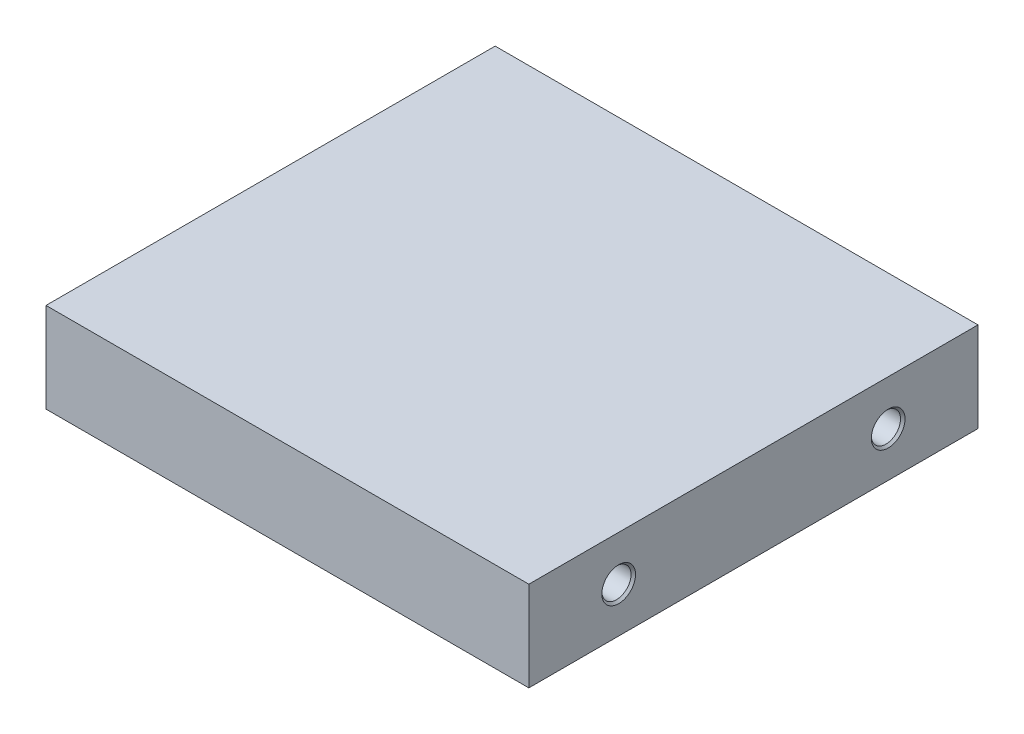
ISO-10303-21;
HEADER;
FILE_DESCRIPTION(('STEP AP214'),'2;1');
FILE_NAME('part.step','',(''),(''),'','','');
FILE_SCHEMA(('AUTOMOTIVE_DESIGN { 1 0 10303 214 1 1 1 1 }'));
ENDSEC;
DATA;
#1=APPLICATION_CONTEXT('core data for automotive mechanical design processes');
#2=APPLICATION_PROTOCOL_DEFINITION('international standard','automotive_design',2000,#1);
#3=PRODUCT_CONTEXT('',#1,'mechanical');
#4=PRODUCT('Part','Part','',(#3));
#5=PRODUCT_RELATED_PRODUCT_CATEGORY('part','',(#4));
#6=PRODUCT_DEFINITION_FORMATION('','',#4);
#7=PRODUCT_DEFINITION_CONTEXT('part definition',#1,'design');
#8=PRODUCT_DEFINITION('design','',#6,#7);
#9=PRODUCT_DEFINITION_SHAPE('','',#8);
#10=(LENGTH_UNIT() NAMED_UNIT(*) SI_UNIT(.MILLI.,.METRE.));
#11=(NAMED_UNIT(*) PLANE_ANGLE_UNIT() SI_UNIT($,.RADIAN.));
#12=(NAMED_UNIT(*) SI_UNIT($,.STERADIAN.) SOLID_ANGLE_UNIT());
#13=UNCERTAINTY_MEASURE_WITH_UNIT(LENGTH_MEASURE(1.E-05),#10,'distance_accuracy_value','');
#14=(GEOMETRIC_REPRESENTATION_CONTEXT(3) GLOBAL_UNCERTAINTY_ASSIGNED_CONTEXT((#13)) GLOBAL_UNIT_ASSIGNED_CONTEXT((#10,
#11,#12)) REPRESENTATION_CONTEXT('',''));
#15=CARTESIAN_POINT('',(0.,0.,0.));
#16=DIRECTION('',(0.,0.,1.));
#17=DIRECTION('',(1.,0.,0.));
#18=AXIS2_PLACEMENT_3D('',#15,#16,#17);
#19=CARTESIAN_POINT('',(21.5,8.,-20.));
#20=DIRECTION('',(-1.,0.,0.));
#21=DIRECTION('',(0.,0.,1.));
#22=AXIS2_PLACEMENT_3D('',#19,#20,#21);
#23=PLANE('',#22);
#24=CARTESIAN_POINT('',(21.5,4.,12.));
#25=DIRECTION('',(-1.,0.,0.));
#26=DIRECTION('',(0.,0.,1.));
#27=AXIS2_PLACEMENT_3D('',#24,#25,#26);
#28=CIRCLE('',#27,1.49999999999999);
#29=CARTESIAN_POINT('',(21.5,4.,13.5));
#30=VERTEX_POINT('',#29);
#31=EDGE_CURVE('E120',#30,#30,#28,.T.);
#32=ORIENTED_EDGE('',*,*,#31,.T.);
#33=EDGE_LOOP('',(#32));
#34=FACE_BOUND('',#33,.T.);
#35=CARTESIAN_POINT('',(21.5,4.,-12.));
#36=DIRECTION('',(-1.,0.,0.));
#37=DIRECTION('',(0.,0.,1.));
#38=AXIS2_PLACEMENT_3D('',#35,#36,#37);
#39=CIRCLE('',#38,1.49999999999999);
#40=CARTESIAN_POINT('',(21.5,4.,-10.5));
#41=VERTEX_POINT('',#40);
#42=EDGE_CURVE('E117',#41,#41,#39,.T.);
#43=ORIENTED_EDGE('',*,*,#42,.T.);
#44=EDGE_LOOP('',(#43));
#45=FACE_BOUND('',#44,.T.);
#46=DIRECTION('',(0.,0.,-1.));
#47=VECTOR('',#46,1.);
#48=CARTESIAN_POINT('',(21.5,0.,-20.));
#49=LINE('',#48,#47);
#50=CARTESIAN_POINT('',(21.5,0.,20.));
#51=VERTEX_POINT('',#50);
#52=CARTESIAN_POINT('',(21.5,0.,-20.));
#53=VERTEX_POINT('',#52);
#54=EDGE_CURVE('E107',#51,#53,#49,.T.);
#55=ORIENTED_EDGE('',*,*,#54,.T.);
#56=DIRECTION('',(0.,-1.,0.));
#57=VECTOR('',#56,1.);
#58=CARTESIAN_POINT('',(21.5,8.,-20.));
#59=LINE('',#58,#57);
#60=CARTESIAN_POINT('',(21.5,8.,-20.));
#61=VERTEX_POINT('',#60);
#62=EDGE_CURVE('E98',#61,#53,#59,.T.);
#63=ORIENTED_EDGE('',*,*,#62,.F.);
#64=DIRECTION('',(0.,0.,-1.));
#65=VECTOR('',#64,1.);
#66=CARTESIAN_POINT('',(21.5,8.,-20.));
#67=LINE('',#66,#65);
#68=CARTESIAN_POINT('',(21.5,8.,20.));
#69=VERTEX_POINT('',#68);
#70=EDGE_CURVE('E92',#69,#61,#67,.T.);
#71=ORIENTED_EDGE('',*,*,#70,.F.);
#72=DIRECTION('',(0.,-1.,0.));
#73=VECTOR('',#72,1.);
#74=CARTESIAN_POINT('',(21.5,8.,20.));
#75=LINE('',#74,#73);
#76=EDGE_CURVE('E103',#69,#51,#75,.T.);
#77=ORIENTED_EDGE('',*,*,#76,.T.);
#78=EDGE_LOOP('',(#55,#63,#71,#77));
#79=FACE_BOUND('',#78,.T.);
#80=ADVANCED_FACE('F38',(#34,#45,#79),#23,.F.);
#81=CARTESIAN_POINT('',(-21.5,8.,-20.));
#82=DIRECTION('',(0.,0.,1.));
#83=DIRECTION('',(1.,0.,0.));
#84=AXIS2_PLACEMENT_3D('',#81,#82,#83);
#85=PLANE('',#84);
#86=DIRECTION('',(-1.,0.,0.));
#87=VECTOR('',#86,1.);
#88=CARTESIAN_POINT('',(-21.5,0.,-20.));
#89=LINE('',#88,#87);
#90=CARTESIAN_POINT('',(-21.5,0.,-20.));
#91=VERTEX_POINT('',#90);
#92=EDGE_CURVE('E97',#53,#91,#89,.T.);
#93=ORIENTED_EDGE('',*,*,#92,.T.);
#94=DIRECTION('',(0.,-1.,0.));
#95=VECTOR('',#94,1.);
#96=CARTESIAN_POINT('',(-21.5,8.,-20.));
#97=LINE('',#96,#95);
#98=CARTESIAN_POINT('',(-21.5,8.,-20.));
#99=VERTEX_POINT('',#98);
#100=EDGE_CURVE('E95',#99,#91,#97,.T.);
#101=ORIENTED_EDGE('',*,*,#100,.F.);
#102=DIRECTION('',(-1.,0.,0.));
#103=VECTOR('',#102,1.);
#104=CARTESIAN_POINT('',(-21.5,8.,-20.));
#105=LINE('',#104,#103);
#106=EDGE_CURVE('E87',#61,#99,#105,.T.);
#107=ORIENTED_EDGE('',*,*,#106,.F.);
#108=ORIENTED_EDGE('',*,*,#62,.T.);
#109=EDGE_LOOP('',(#93,#101,#107,#108));
#110=FACE_BOUND('',#109,.T.);
#111=ADVANCED_FACE('F96',(#110),#85,.F.);
#112=CARTESIAN_POINT('',(-21.5,8.,-20.));
#113=DIRECTION('',(1.,0.,0.));
#114=DIRECTION('',(0.,0.,-1.));
#115=AXIS2_PLACEMENT_3D('',#112,#113,#114);
#116=PLANE('',#115);
#117=CARTESIAN_POINT('',(-21.5,4.,12.));
#118=DIRECTION('',(1.,0.,0.));
#119=DIRECTION('',(0.,0.,-1.));
#120=AXIS2_PLACEMENT_3D('',#117,#118,#119);
#121=CIRCLE('',#120,1.50000000000002);
#122=CARTESIAN_POINT('',(-21.5,4.,10.5));
#123=VERTEX_POINT('',#122);
#124=EDGE_CURVE('E48',#123,#123,#121,.T.);
#125=ORIENTED_EDGE('',*,*,#124,.T.);
#126=EDGE_LOOP('',(#125));
#127=FACE_BOUND('',#126,.T.);
#128=CARTESIAN_POINT('',(-21.5,4.,-12.));
#129=DIRECTION('',(1.,0.,0.));
#130=DIRECTION('',(0.,0.,-1.));
#131=AXIS2_PLACEMENT_3D('',#128,#129,#130);
#132=CIRCLE('',#131,1.50000000000002);
#133=CARTESIAN_POINT('',(-21.5,4.,-13.5));
#134=VERTEX_POINT('',#133);
#135=EDGE_CURVE('E132',#134,#134,#132,.T.);
#136=ORIENTED_EDGE('',*,*,#135,.T.);
#137=EDGE_LOOP('',(#136));
#138=FACE_BOUND('',#137,.T.);
#139=DIRECTION('',(0.,0.,1.));
#140=VECTOR('',#139,1.);
#141=CARTESIAN_POINT('',(-21.5,0.,-20.));
#142=LINE('',#141,#140);
#143=CARTESIAN_POINT('',(-21.5,0.,20.));
#144=VERTEX_POINT('',#143);
#145=EDGE_CURVE('E73',#91,#144,#142,.T.);
#146=ORIENTED_EDGE('',*,*,#145,.T.);
#147=DIRECTION('',(0.,-1.,0.));
#148=VECTOR('',#147,1.);
#149=CARTESIAN_POINT('',(-21.5,8.,20.));
#150=LINE('',#149,#148);
#151=CARTESIAN_POINT('',(-21.5,8.,20.));
#152=VERTEX_POINT('',#151);
#153=EDGE_CURVE('E99',#152,#144,#150,.T.);
#154=ORIENTED_EDGE('',*,*,#153,.F.);
#155=DIRECTION('',(0.,0.,1.));
#156=VECTOR('',#155,1.);
#157=CARTESIAN_POINT('',(-21.5,8.,-20.));
#158=LINE('',#157,#156);
#159=EDGE_CURVE('E90',#99,#152,#158,.T.);
#160=ORIENTED_EDGE('',*,*,#159,.F.);
#161=ORIENTED_EDGE('',*,*,#100,.T.);
#162=EDGE_LOOP('',(#146,#154,#160,#161));
#163=FACE_BOUND('',#162,.T.);
#164=ADVANCED_FACE('F101',(#127,#138,#163),#116,.F.);
#165=CARTESIAN_POINT('',(-21.5,8.,20.));
#166=DIRECTION('',(0.,0.,-1.));
#167=DIRECTION('',(-1.,0.,0.));
#168=AXIS2_PLACEMENT_3D('',#165,#166,#167);
#169=PLANE('',#168);
#170=DIRECTION('',(1.,0.,0.));
#171=VECTOR('',#170,1.);
#172=CARTESIAN_POINT('',(-21.5,0.,20.));
#173=LINE('',#172,#171);
#174=EDGE_CURVE('E79',#144,#51,#173,.T.);
#175=ORIENTED_EDGE('',*,*,#174,.T.);
#176=ORIENTED_EDGE('',*,*,#76,.F.);
#177=DIRECTION('',(1.,0.,0.));
#178=VECTOR('',#177,1.);
#179=CARTESIAN_POINT('',(-21.5,8.,20.));
#180=LINE('',#179,#178);
#181=EDGE_CURVE('E56',#152,#69,#180,.T.);
#182=ORIENTED_EDGE('',*,*,#181,.F.);
#183=ORIENTED_EDGE('',*,*,#153,.T.);
#184=EDGE_LOOP('',(#175,#176,#182,#183));
#185=FACE_BOUND('',#184,.T.);
#186=ADVANCED_FACE('F222',(#185),#169,.F.);
#187=CARTESIAN_POINT('',(0.,8.,0.));
#188=DIRECTION('',(0.,1.,0.));
#189=DIRECTION('',(0.,0.,1.));
#190=AXIS2_PLACEMENT_3D('',#187,#188,#189);
#191=PLANE('',#190);
#192=ORIENTED_EDGE('',*,*,#70,.T.);
#193=ORIENTED_EDGE('',*,*,#106,.T.);
#194=ORIENTED_EDGE('',*,*,#159,.T.);
#195=ORIENTED_EDGE('',*,*,#181,.T.);
#196=EDGE_LOOP('',(#192,#193,#194,#195));
#197=FACE_BOUND('',#196,.T.);
#198=ADVANCED_FACE('F88',(#197),#191,.T.);
#199=CARTESIAN_POINT('',(0.,0.,0.));
#200=DIRECTION('',(0.,1.,0.));
#201=DIRECTION('',(0.,0.,1.));
#202=AXIS2_PLACEMENT_3D('',#199,#200,#201);
#203=PLANE('',#202);
#204=ORIENTED_EDGE('',*,*,#54,.F.);
#205=ORIENTED_EDGE('',*,*,#174,.F.);
#206=ORIENTED_EDGE('',*,*,#145,.F.);
#207=ORIENTED_EDGE('',*,*,#92,.F.);
#208=EDGE_LOOP('',(#204,#205,#206,#207));
#209=FACE_BOUND('',#208,.T.);
#210=ADVANCED_FACE('F149',(#209),#203,.F.);
#211=CARTESIAN_POINT('',(-13.5,4.,12.));
#212=DIRECTION('',(-1.,0.,0.));
#213=DIRECTION('',(0.,0.,1.));
#214=AXIS2_PLACEMENT_3D('',#211,#212,#213);
#215=CYLINDRICAL_SURFACE('',#214,1.3);
#216=CARTESIAN_POINT('',(-21.3,4.,12.));
#217=DIRECTION('',(1.,0.,0.));
#218=DIRECTION('',(0.,0.,-1.));
#219=AXIS2_PLACEMENT_3D('',#216,#217,#218);
#220=CIRCLE('',#219,1.3);
#221=CARTESIAN_POINT('',(-21.3,4.,10.7));
#222=VERTEX_POINT('',#221);
#223=EDGE_CURVE('E129',#222,#222,#220,.F.);
#224=ORIENTED_EDGE('',*,*,#223,.T.);
#225=EDGE_LOOP('',(#224));
#226=FACE_BOUND('',#225,.T.);
#227=CARTESIAN_POINT('',(-13.5,4.,12.));
#228=DIRECTION('',(-1.,0.,0.));
#229=DIRECTION('',(0.,0.,1.));
#230=AXIS2_PLACEMENT_3D('',#227,#228,#229);
#231=CIRCLE('',#230,1.3);
#232=CARTESIAN_POINT('',(-13.5,4.,13.3));
#233=VERTEX_POINT('',#232);
#234=EDGE_CURVE('E153',#233,#233,#231,.T.);
#235=ORIENTED_EDGE('',*,*,#234,.F.);
#236=EDGE_LOOP('',(#235));
#237=FACE_BOUND('',#236,.T.);
#238=ADVANCED_FACE('F145',(#226,#237),#215,.F.);
#239=CARTESIAN_POINT('',(-13.5,4.,12.));
#240=DIRECTION('',(-1.,0.,0.));
#241=DIRECTION('',(0.,0.,1.));
#242=AXIS2_PLACEMENT_3D('',#239,#240,#241);
#243=PLANE('',#242);
#244=ORIENTED_EDGE('',*,*,#234,.T.);
#245=EDGE_LOOP('',(#244));
#246=FACE_BOUND('',#245,.T.);
#247=ADVANCED_FACE('F148',(#246),#243,.T.);
#248=CARTESIAN_POINT('',(-13.5,4.,-12.));
#249=DIRECTION('',(-1.,0.,0.));
#250=DIRECTION('',(0.,0.,1.));
#251=AXIS2_PLACEMENT_3D('',#248,#249,#250);
#252=CYLINDRICAL_SURFACE('',#251,1.3);
#253=CARTESIAN_POINT('',(-21.3,4.,-12.));
#254=DIRECTION('',(1.,0.,0.));
#255=DIRECTION('',(0.,0.,-1.));
#256=AXIS2_PLACEMENT_3D('',#253,#254,#255);
#257=CIRCLE('',#256,1.3);
#258=CARTESIAN_POINT('',(-21.3,4.,-13.3));
#259=VERTEX_POINT('',#258);
#260=EDGE_CURVE('E11',#259,#259,#257,.F.);
#261=ORIENTED_EDGE('',*,*,#260,.T.);
#262=EDGE_LOOP('',(#261));
#263=FACE_BOUND('',#262,.T.);
#264=CARTESIAN_POINT('',(-13.5,4.,-12.));
#265=DIRECTION('',(-1.,0.,0.));
#266=DIRECTION('',(0.,0.,1.));
#267=AXIS2_PLACEMENT_3D('',#264,#265,#266);
#268=CIRCLE('',#267,1.3);
#269=CARTESIAN_POINT('',(-13.5,4.,-10.7));
#270=VERTEX_POINT('',#269);
#271=EDGE_CURVE('E110',#270,#270,#268,.T.);
#272=ORIENTED_EDGE('',*,*,#271,.F.);
#273=EDGE_LOOP('',(#272));
#274=FACE_BOUND('',#273,.T.);
#275=ADVANCED_FACE('F254',(#263,#274),#252,.F.);
#276=CARTESIAN_POINT('',(-13.5,4.,-12.));
#277=DIRECTION('',(-1.,0.,0.));
#278=DIRECTION('',(0.,0.,1.));
#279=AXIS2_PLACEMENT_3D('',#276,#277,#278);
#280=PLANE('',#279);
#281=ORIENTED_EDGE('',*,*,#271,.T.);
#282=EDGE_LOOP('',(#281));
#283=FACE_BOUND('',#282,.T.);
#284=ADVANCED_FACE('F179',(#283),#280,.T.);
#285=CARTESIAN_POINT('',(13.5,4.,12.));
#286=DIRECTION('',(1.,0.,0.));
#287=DIRECTION('',(0.,0.,-1.));
#288=AXIS2_PLACEMENT_3D('',#285,#286,#287);
#289=CYLINDRICAL_SURFACE('',#288,1.3);
#290=CARTESIAN_POINT('',(21.3,4.,12.));
#291=DIRECTION('',(-1.,0.,0.));
#292=DIRECTION('',(0.,0.,1.));
#293=AXIS2_PLACEMENT_3D('',#290,#291,#292);
#294=CIRCLE('',#293,1.3);
#295=CARTESIAN_POINT('',(21.3,4.,13.3));
#296=VERTEX_POINT('',#295);
#297=EDGE_CURVE('E123',#296,#296,#294,.F.);
#298=ORIENTED_EDGE('',*,*,#297,.T.);
#299=EDGE_LOOP('',(#298));
#300=FACE_BOUND('',#299,.T.);
#301=CARTESIAN_POINT('',(13.5,4.,12.));
#302=DIRECTION('',(-1.,0.,0.));
#303=DIRECTION('',(0.,0.,1.));
#304=AXIS2_PLACEMENT_3D('',#301,#302,#303);
#305=CIRCLE('',#304,1.3);
#306=CARTESIAN_POINT('',(13.5,4.,13.3));
#307=VERTEX_POINT('',#306);
#308=EDGE_CURVE('E160',#307,#307,#305,.T.);
#309=ORIENTED_EDGE('',*,*,#308,.T.);
#310=EDGE_LOOP('',(#309));
#311=FACE_BOUND('',#310,.T.);
#312=ADVANCED_FACE('F166',(#300,#311),#289,.F.);
#313=CARTESIAN_POINT('',(13.5,4.,12.));
#314=DIRECTION('',(1.,0.,0.));
#315=DIRECTION('',(0.,0.,1.));
#316=AXIS2_PLACEMENT_3D('',#313,#314,#315);
#317=PLANE('',#316);
#318=ORIENTED_EDGE('',*,*,#308,.F.);
#319=EDGE_LOOP('',(#318));
#320=FACE_BOUND('',#319,.T.);
#321=ADVANCED_FACE('F168',(#320),#317,.T.);
#322=CARTESIAN_POINT('',(13.5,4.,-12.));
#323=DIRECTION('',(1.,0.,0.));
#324=DIRECTION('',(0.,0.,-1.));
#325=AXIS2_PLACEMENT_3D('',#322,#323,#324);
#326=CYLINDRICAL_SURFACE('',#325,1.3);
#327=CARTESIAN_POINT('',(21.3,4.,-12.));
#328=DIRECTION('',(-1.,0.,0.));
#329=DIRECTION('',(0.,0.,1.));
#330=AXIS2_PLACEMENT_3D('',#327,#328,#329);
#331=CIRCLE('',#330,1.3);
#332=CARTESIAN_POINT('',(21.3,4.,-10.7));
#333=VERTEX_POINT('',#332);
#334=EDGE_CURVE('E126',#333,#333,#331,.F.);
#335=ORIENTED_EDGE('',*,*,#334,.T.);
#336=EDGE_LOOP('',(#335));
#337=FACE_BOUND('',#336,.T.);
#338=CARTESIAN_POINT('',(13.5,4.,-12.));
#339=DIRECTION('',(-1.,0.,0.));
#340=DIRECTION('',(0.,0.,1.));
#341=AXIS2_PLACEMENT_3D('',#338,#339,#340);
#342=CIRCLE('',#341,1.3);
#343=CARTESIAN_POINT('',(13.5,4.,-10.7));
#344=VERTEX_POINT('',#343);
#345=EDGE_CURVE('E155',#344,#344,#342,.T.);
#346=ORIENTED_EDGE('',*,*,#345,.T.);
#347=EDGE_LOOP('',(#346));
#348=FACE_BOUND('',#347,.T.);
#349=ADVANCED_FACE('F170',(#337,#348),#326,.F.);
#350=CARTESIAN_POINT('',(13.5,4.,-12.));
#351=DIRECTION('',(1.,0.,0.));
#352=DIRECTION('',(0.,0.,1.));
#353=AXIS2_PLACEMENT_3D('',#350,#351,#352);
#354=PLANE('',#353);
#355=ORIENTED_EDGE('',*,*,#345,.F.);
#356=EDGE_LOOP('',(#355));
#357=FACE_BOUND('',#356,.T.);
#358=ADVANCED_FACE('F176',(#357),#354,.T.);
#359=CARTESIAN_POINT('',(21.5,4.,12.));
#360=DIRECTION('',(1.,0.,0.));
#361=DIRECTION('',(0.,0.,-1.));
#362=AXIS2_PLACEMENT_3D('',#359,#360,#361);
#363=CONICAL_SURFACE('',#362,1.49999999999999,0.785398163397442);
#364=ORIENTED_EDGE('',*,*,#297,.F.);
#365=EDGE_LOOP('',(#364));
#366=FACE_BOUND('',#365,.T.);
#367=ORIENTED_EDGE('',*,*,#31,.F.);
#368=EDGE_LOOP('',(#367));
#369=FACE_BOUND('',#368,.T.);
#370=ADVANCED_FACE('F193',(#366,#369),#363,.F.);
#371=CARTESIAN_POINT('',(21.5,4.,-12.));
#372=DIRECTION('',(1.,0.,0.));
#373=DIRECTION('',(0.,0.,-1.));
#374=AXIS2_PLACEMENT_3D('',#371,#372,#373);
#375=CONICAL_SURFACE('',#374,1.49999999999999,0.785398163397459);
#376=ORIENTED_EDGE('',*,*,#334,.F.);
#377=EDGE_LOOP('',(#376));
#378=FACE_BOUND('',#377,.T.);
#379=ORIENTED_EDGE('',*,*,#42,.F.);
#380=EDGE_LOOP('',(#379));
#381=FACE_BOUND('',#380,.T.);
#382=ADVANCED_FACE('F142',(#378,#381),#375,.F.);
#383=CARTESIAN_POINT('',(-21.3,4.,12.));
#384=DIRECTION('',(-1.,0.,0.));
#385=DIRECTION('',(0.,0.,1.));
#386=AXIS2_PLACEMENT_3D('',#383,#384,#385);
#387=CONICAL_SURFACE('',#386,1.3,0.785398163397476);
#388=ORIENTED_EDGE('',*,*,#124,.F.);
#389=EDGE_LOOP('',(#388));
#390=FACE_BOUND('',#389,.T.);
#391=ORIENTED_EDGE('',*,*,#223,.F.);
#392=EDGE_LOOP('',(#391));
#393=FACE_BOUND('',#392,.T.);
#394=ADVANCED_FACE('F139',(#390,#393),#387,.F.);
#395=CARTESIAN_POINT('',(-21.3,4.,-12.));
#396=DIRECTION('',(-1.,0.,0.));
#397=DIRECTION('',(0.,0.,1.));
#398=AXIS2_PLACEMENT_3D('',#395,#396,#397);
#399=CONICAL_SURFACE('',#398,1.3,0.785398163397476);
#400=ORIENTED_EDGE('',*,*,#135,.F.);
#401=EDGE_LOOP('',(#400));
#402=FACE_BOUND('',#401,.T.);
#403=ORIENTED_EDGE('',*,*,#260,.F.);
#404=EDGE_LOOP('',(#403));
#405=FACE_BOUND('',#404,.T.);
#406=ADVANCED_FACE('F41',(#402,#405),#399,.F.);
#407=CLOSED_SHELL('',(#80,#111,#164,#186,#198,#210,#238,#247,#275,#284,#312,#321,#349,#358,#370,
#382,#394,#406));
#408=MANIFOLD_SOLID_BREP('B2',#407);
#409=ADVANCED_BREP_SHAPE_REPRESENTATION('',(#18,#408),#14);
#410=SHAPE_DEFINITION_REPRESENTATION(#9,#409);
ENDSEC;
END-ISO-10303-21;
